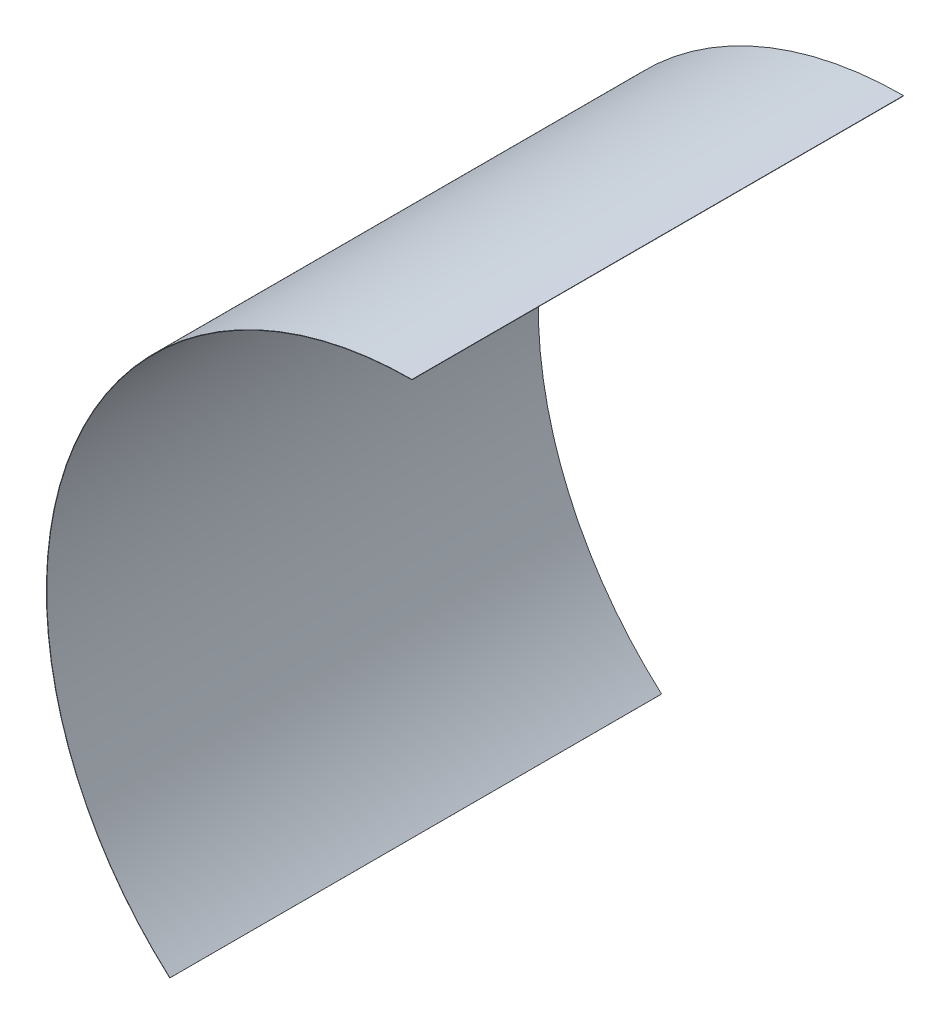
ISO-10303-21;
HEADER;
FILE_DESCRIPTION(('STEP AP214'),'2;1');
FILE_NAME('part.step','',(''),(''),'','','');
FILE_SCHEMA(('AUTOMOTIVE_DESIGN { 1 0 10303 214 1 1 1 1 }'));
ENDSEC;
DATA;
#1=APPLICATION_CONTEXT('core data for automotive mechanical design processes');
#2=APPLICATION_PROTOCOL_DEFINITION('international standard','automotive_design',2000,#1);
#3=PRODUCT_CONTEXT('',#1,'mechanical');
#4=PRODUCT('Part','Part','',(#3));
#5=PRODUCT_RELATED_PRODUCT_CATEGORY('part','',(#4));
#6=PRODUCT_DEFINITION_FORMATION('','',#4);
#7=PRODUCT_DEFINITION_CONTEXT('part definition',#1,'design');
#8=PRODUCT_DEFINITION('design','',#6,#7);
#9=PRODUCT_DEFINITION_SHAPE('','',#8);
#10=(LENGTH_UNIT() NAMED_UNIT(*) SI_UNIT(.MILLI.,.METRE.));
#11=(NAMED_UNIT(*) PLANE_ANGLE_UNIT() SI_UNIT($,.RADIAN.));
#12=(NAMED_UNIT(*) SI_UNIT($,.STERADIAN.) SOLID_ANGLE_UNIT());
#13=UNCERTAINTY_MEASURE_WITH_UNIT(LENGTH_MEASURE(1.E-05),#10,'distance_accuracy_value','');
#14=(GEOMETRIC_REPRESENTATION_CONTEXT(3) GLOBAL_UNCERTAINTY_ASSIGNED_CONTEXT((#13)) GLOBAL_UNIT_ASSIGNED_CONTEXT((#10,
#11,#12)) REPRESENTATION_CONTEXT('',''));
#15=CARTESIAN_POINT('',(0.,0.,0.));
#16=DIRECTION('',(0.,0.,1.));
#17=DIRECTION('',(1.,0.,0.));
#18=AXIS2_PLACEMENT_3D('',#15,#16,#17);
#19=CARTESIAN_POINT('',(768.626762422092,869.093406078157,0.));
#20=DIRECTION('',(0.,0.,1.));
#21=DIRECTION('',(1.,0.,0.));
#22=AXIS2_PLACEMENT_3D('',#19,#20,#21);
#23=PLANE('',#22);
#24=DIRECTION('',(0.662483634502156,0.749076387304268,0.));
#25=VECTOR('',#24,1.);
#26=CARTESIAN_POINT('',(5.55111512312578E-13,-5.55111512312578E-13,0.));
#27=LINE('',#26,#25);
#28=CARTESIAN_POINT('',(5.55111512312578E-13,-5.55111512312578E-13,0.));
#29=VERTEX_POINT('',#28);
#30=CARTESIAN_POINT('',(0.662483634502387,0.749076387303815,0.));
#31=VERTEX_POINT('',#30);
#32=EDGE_CURVE('E11',#29,#31,#27,.T.);
#33=ORIENTED_EDGE('',*,*,#32,.F.);
#34=CARTESIAN_POINT('',(768.626762422092,869.093406078157,0.));
#35=DIRECTION('',(0.,0.,-1.));
#36=DIRECTION('',(-1.,0.,0.));
#37=AXIS2_PLACEMENT_3D('',#34,#35,#36);
#38=CIRCLE('',#37,1160.22);
#39=CARTESIAN_POINT('',(768.626762422092,2029.31340607816,0.));
#40=VERTEX_POINT('',#39);
#41=EDGE_CURVE('E95',#29,#40,#38,.T.);
#42=ORIENTED_EDGE('',*,*,#41,.T.);
#43=DIRECTION('',(0.,-1.,0.));
#44=VECTOR('',#43,1.);
#45=CARTESIAN_POINT('',(768.626762422092,2029.31340607816,0.));
#46=LINE('',#45,#44);
#47=CARTESIAN_POINT('',(768.626762422092,2028.31340607816,0.));
#48=VERTEX_POINT('',#47);
#49=EDGE_CURVE('E45',#40,#48,#46,.T.);
#50=ORIENTED_EDGE('',*,*,#49,.T.);
#51=CARTESIAN_POINT('',(768.626762422092,869.093406078157,0.));
#52=DIRECTION('',(0.,0.,1.));
#53=DIRECTION('',(1.,0.,0.));
#54=AXIS2_PLACEMENT_3D('',#51,#52,#53);
#55=CIRCLE('',#54,1159.22);
#56=EDGE_CURVE('E104',#31,#48,#55,.F.);
#57=ORIENTED_EDGE('',*,*,#56,.F.);
#58=EDGE_LOOP('',(#33,#42,#50,#57));
#59=FACE_BOUND('',#58,.T.);
#60=ADVANCED_FACE('F35',(#59),#23,.F.);
#61=CARTESIAN_POINT('',(768.626762422092,2029.31340607816,780.));
#62=DIRECTION('',(-1.,0.,0.));
#63=DIRECTION('',(0.,0.,1.));
#64=AXIS2_PLACEMENT_3D('',#61,#62,#63);
#65=PLANE('',#64);
#66=ORIENTED_EDGE('',*,*,#49,.F.);
#67=DIRECTION('',(0.,0.,1.));
#68=VECTOR('',#67,1.);
#69=CARTESIAN_POINT('',(768.626762422092,2029.31340607816,0.));
#70=LINE('',#69,#68);
#71=CARTESIAN_POINT('',(768.626762422092,2029.31340607816,1560.));
#72=VERTEX_POINT('',#71);
#73=EDGE_CURVE('E91',#40,#72,#70,.T.);
#74=ORIENTED_EDGE('',*,*,#73,.T.);
#75=DIRECTION('',(0.,-1.,0.));
#76=VECTOR('',#75,1.);
#77=CARTESIAN_POINT('',(768.626762422092,2029.31340607816,1560.));
#78=LINE('',#77,#76);
#79=CARTESIAN_POINT('',(768.626762422092,2028.31340607816,1560.));
#80=VERTEX_POINT('',#79);
#81=EDGE_CURVE('E76',#72,#80,#78,.T.);
#82=ORIENTED_EDGE('',*,*,#81,.T.);
#83=DIRECTION('',(0.,0.,1.));
#84=VECTOR('',#83,1.);
#85=CARTESIAN_POINT('',(768.626762422092,2028.31340607816,0.));
#86=LINE('',#85,#84);
#87=EDGE_CURVE('E106',#48,#80,#86,.T.);
#88=ORIENTED_EDGE('',*,*,#87,.F.);
#89=EDGE_LOOP('',(#66,#74,#82,#88));
#90=FACE_BOUND('',#89,.T.);
#91=ADVANCED_FACE('F94',(#90),#65,.F.);
#92=CARTESIAN_POINT('',(768.626762422092,869.093406078157,1560.));
#93=DIRECTION('',(0.,0.,1.));
#94=DIRECTION('',(1.,0.,0.));
#95=AXIS2_PLACEMENT_3D('',#92,#93,#94);
#96=PLANE('',#95);
#97=ORIENTED_EDGE('',*,*,#81,.F.);
#98=CARTESIAN_POINT('',(768.626762422092,869.093406078157,1560.));
#99=DIRECTION('',(0.,0.,-1.));
#100=DIRECTION('',(-1.,0.,0.));
#101=AXIS2_PLACEMENT_3D('',#98,#99,#100);
#102=CIRCLE('',#101,1160.22);
#103=CARTESIAN_POINT('',(5.55111512312578E-13,-5.55111512312578E-13,1560.));
#104=VERTEX_POINT('',#103);
#105=EDGE_CURVE('E79',#104,#72,#102,.T.);
#106=ORIENTED_EDGE('',*,*,#105,.F.);
#107=DIRECTION('',(0.662483634502156,0.749076387304268,0.));
#108=VECTOR('',#107,1.);
#109=CARTESIAN_POINT('',(5.55111512312578E-13,-5.55111512312578E-13,1560.));
#110=LINE('',#109,#108);
#111=CARTESIAN_POINT('',(0.662483634502387,0.749076387303815,1560.));
#112=VERTEX_POINT('',#111);
#113=EDGE_CURVE('E39',#104,#112,#110,.T.);
#114=ORIENTED_EDGE('',*,*,#113,.T.);
#115=CARTESIAN_POINT('',(768.626762422092,869.093406078157,1560.));
#116=DIRECTION('',(0.,0.,1.));
#117=DIRECTION('',(1.,0.,0.));
#118=AXIS2_PLACEMENT_3D('',#115,#116,#117);
#119=CIRCLE('',#118,1159.22);
#120=EDGE_CURVE('E81',#112,#80,#119,.F.);
#121=ORIENTED_EDGE('',*,*,#120,.T.);
#122=EDGE_LOOP('',(#97,#106,#114,#121));
#123=FACE_BOUND('',#122,.T.);
#124=ADVANCED_FACE('F78',(#123),#96,.T.);
#125=CARTESIAN_POINT('',(5.55111512312578E-13,-5.55111512312578E-13,780.));
#126=DIRECTION('',(0.749076387304268,-0.662483634502156,0.));
#127=DIRECTION('',(0.,0.,1.));
#128=AXIS2_PLACEMENT_3D('',#125,#126,#127);
#129=PLANE('',#128);
#130=DIRECTION('',(0.,0.,1.));
#131=VECTOR('',#130,1.);
#132=CARTESIAN_POINT('',(5.55111512312578E-13,-5.55111512312578E-13,0.));
#133=LINE('',#132,#131);
#134=EDGE_CURVE('E92',#29,#104,#133,.T.);
#135=ORIENTED_EDGE('',*,*,#134,.F.);
#136=ORIENTED_EDGE('',*,*,#32,.T.);
#137=DIRECTION('',(0.,0.,1.));
#138=VECTOR('',#137,1.);
#139=CARTESIAN_POINT('',(0.662483634502387,0.749076387303815,0.));
#140=LINE('',#139,#138);
#141=EDGE_CURVE('E97',#31,#112,#140,.T.);
#142=ORIENTED_EDGE('',*,*,#141,.T.);
#143=ORIENTED_EDGE('',*,*,#113,.F.);
#144=EDGE_LOOP('',(#135,#136,#142,#143));
#145=FACE_BOUND('',#144,.T.);
#146=ADVANCED_FACE('F37',(#145),#129,.T.);
#147=CARTESIAN_POINT('',(768.626762422092,869.093406078157,0.));
#148=DIRECTION('',(0.,0.,1.));
#149=DIRECTION('',(1.,0.,0.));
#150=AXIS2_PLACEMENT_3D('',#147,#148,#149);
#151=CYLINDRICAL_SURFACE('',#150,1159.22);
#152=ORIENTED_EDGE('',*,*,#120,.F.);
#153=ORIENTED_EDGE('',*,*,#141,.F.);
#154=ORIENTED_EDGE('',*,*,#56,.T.);
#155=ORIENTED_EDGE('',*,*,#87,.T.);
#156=EDGE_LOOP('',(#152,#153,#154,#155));
#157=FACE_BOUND('',#156,.T.);
#158=ADVANCED_FACE('F109',(#157),#151,.F.);
#159=CARTESIAN_POINT('',(768.626762422092,869.093406078157,0.));
#160=DIRECTION('',(0.,0.,1.));
#161=DIRECTION('',(1.,0.,0.));
#162=AXIS2_PLACEMENT_3D('',#159,#160,#161);
#163=CYLINDRICAL_SURFACE('',#162,1160.22);
#164=ORIENTED_EDGE('',*,*,#105,.T.);
#165=ORIENTED_EDGE('',*,*,#73,.F.);
#166=ORIENTED_EDGE('',*,*,#41,.F.);
#167=ORIENTED_EDGE('',*,*,#134,.T.);
#168=EDGE_LOOP('',(#164,#165,#166,#167));
#169=FACE_BOUND('',#168,.T.);
#170=ADVANCED_FACE('F89',(#169),#163,.T.);
#171=CLOSED_SHELL('',(#60,#91,#124,#146,#158,#170));
#172=MANIFOLD_SOLID_BREP('B2',#171);
#173=ADVANCED_BREP_SHAPE_REPRESENTATION('',(#18,#172),#14);
#174=SHAPE_DEFINITION_REPRESENTATION(#9,#173);
ENDSEC;
END-ISO-10303-21;
